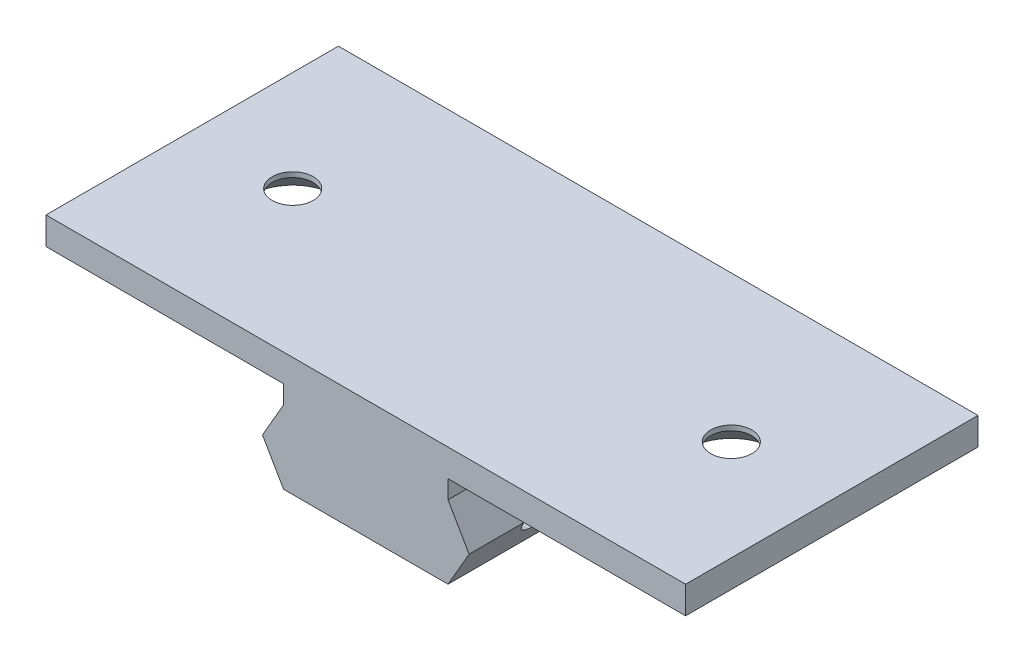
ISO-10303-21;
HEADER;
FILE_DESCRIPTION(('STEP AP214'),'2;1');
FILE_NAME('part.step','',(''),(''),'','','');
FILE_SCHEMA(('AUTOMOTIVE_DESIGN { 1 0 10303 214 1 1 1 1 }'));
ENDSEC;
DATA;
#1=APPLICATION_CONTEXT('core data for automotive mechanical design processes');
#2=APPLICATION_PROTOCOL_DEFINITION('international standard','automotive_design',2000,#1);
#3=PRODUCT_CONTEXT('',#1,'mechanical');
#4=PRODUCT('Part','Part','',(#3));
#5=PRODUCT_RELATED_PRODUCT_CATEGORY('part','',(#4));
#6=PRODUCT_DEFINITION_FORMATION('','',#4);
#7=PRODUCT_DEFINITION_CONTEXT('part definition',#1,'design');
#8=PRODUCT_DEFINITION('design','',#6,#7);
#9=PRODUCT_DEFINITION_SHAPE('','',#8);
#10=(LENGTH_UNIT() NAMED_UNIT(*) SI_UNIT(.MILLI.,.METRE.));
#11=(NAMED_UNIT(*) PLANE_ANGLE_UNIT() SI_UNIT($,.RADIAN.));
#12=(NAMED_UNIT(*) SI_UNIT($,.STERADIAN.) SOLID_ANGLE_UNIT());
#13=UNCERTAINTY_MEASURE_WITH_UNIT(LENGTH_MEASURE(1.E-05),#10,'distance_accuracy_value','');
#14=(GEOMETRIC_REPRESENTATION_CONTEXT(3) GLOBAL_UNCERTAINTY_ASSIGNED_CONTEXT((#13)) GLOBAL_UNIT_ASSIGNED_CONTEXT((#10,
#11,#12)) REPRESENTATION_CONTEXT('',''));
#15=CARTESIAN_POINT('',(0.,0.,0.));
#16=DIRECTION('',(0.,0.,1.));
#17=DIRECTION('',(1.,0.,0.));
#18=AXIS2_PLACEMENT_3D('',#15,#16,#17);
#19=CARTESIAN_POINT('',(11.3094010767585,4.00000000000005,32.));
#20=DIRECTION('',(-0.86602540378444,0.499999999999998,0.));
#21=DIRECTION('',(-0.499999999999998,-0.86602540378444,0.));
#22=AXIS2_PLACEMENT_3D('',#19,#20,#21);
#23=PLANE('',#22);
#24=DIRECTION('',(0.,0.,-1.));
#25=VECTOR('',#24,1.);
#26=CARTESIAN_POINT('',(11.3094010767585,4.00000000000005,32.));
#27=LINE('',#26,#25);
#28=CARTESIAN_POINT('',(11.3094010767585,4.00000000000005,14.));
#29=VERTEX_POINT('',#28);
#30=CARTESIAN_POINT('',(11.3094010767585,4.00000000000005,10.));
#31=VERTEX_POINT('',#30);
#32=EDGE_CURVE('E383',#29,#31,#27,.T.);
#33=ORIENTED_EDGE('',*,*,#32,.F.);
#34=CARTESIAN_POINT('',(11.3094010767585,4.00000000000005,16.));
#35=DIRECTION('',(-0.86602540378444,0.499999999999998,0.));
#36=DIRECTION('',(0.499999999999998,0.86602540378444,0.));
#37=AXIS2_PLACEMENT_3D('',#34,#35,#36);
#38=ELLIPSE('',#37,2.3094010767585,2.);
#39=CARTESIAN_POINT('',(11.3094010767585,4.00000000000005,18.));
#40=VERTEX_POINT('',#39);
#41=EDGE_CURVE('E68',#29,#40,#38,.T.);
#42=ORIENTED_EDGE('',*,*,#41,.T.);
#43=CARTESIAN_POINT('',(11.3094010767585,4.00000000000005,22.));
#44=VERTEX_POINT('',#43);
#45=EDGE_CURVE('E349',#44,#40,#27,.T.);
#46=ORIENTED_EDGE('',*,*,#45,.F.);
#47=CARTESIAN_POINT('',(11.3094010767585,4.00000000000005,24.));
#48=DIRECTION('',(-0.86602540378444,0.499999999999998,0.));
#49=DIRECTION('',(0.499999999999998,0.86602540378444,0.));
#50=AXIS2_PLACEMENT_3D('',#47,#48,#49);
#51=ELLIPSE('',#50,2.3094010767585,2.);
#52=CARTESIAN_POINT('',(11.3094010767585,4.00000000000005,26.));
#53=VERTEX_POINT('',#52);
#54=EDGE_CURVE('E286',#44,#53,#51,.T.);
#55=ORIENTED_EDGE('',*,*,#54,.T.);
#56=CARTESIAN_POINT('',(11.3094010767585,4.00000000000005,32.));
#57=VERTEX_POINT('',#56);
#58=EDGE_CURVE('E344',#57,#53,#27,.T.);
#59=ORIENTED_EDGE('',*,*,#58,.F.);
#60=DIRECTION('',(0.499999999999998,0.86602540378444,0.));
#61=VECTOR('',#60,1.);
#62=CARTESIAN_POINT('',(11.3094010767585,4.00000000000005,32.));
#63=LINE('',#62,#61);
#64=CARTESIAN_POINT('',(9.,0.,32.));
#65=VERTEX_POINT('',#64);
#66=EDGE_CURVE('E291',#65,#57,#63,.T.);
#67=ORIENTED_EDGE('',*,*,#66,.F.);
#68=DIRECTION('',(0.,0.,-1.));
#69=VECTOR('',#68,1.);
#70=CARTESIAN_POINT('',(9.,0.,32.));
#71=LINE('',#70,#69);
#72=CARTESIAN_POINT('',(9.,0.,0.));
#73=VERTEX_POINT('',#72);
#74=EDGE_CURVE('E307',#65,#73,#71,.T.);
#75=ORIENTED_EDGE('',*,*,#74,.T.);
#76=DIRECTION('',(0.499999999999998,0.86602540378444,0.));
#77=VECTOR('',#76,1.);
#78=CARTESIAN_POINT('',(11.3094010767585,4.00000000000005,0.));
#79=LINE('',#78,#77);
#80=CARTESIAN_POINT('',(11.3094010767585,4.00000000000005,0.));
#81=VERTEX_POINT('',#80);
#82=EDGE_CURVE('E290',#73,#81,#79,.T.);
#83=ORIENTED_EDGE('',*,*,#82,.T.);
#84=CARTESIAN_POINT('',(11.3094010767585,4.00000000000005,6.));
#85=VERTEX_POINT('',#84);
#86=EDGE_CURVE('E343',#85,#81,#27,.T.);
#87=ORIENTED_EDGE('',*,*,#86,.F.);
#88=CARTESIAN_POINT('',(11.3094010767585,4.00000000000005,8.));
#89=DIRECTION('',(-0.86602540378444,0.499999999999998,0.));
#90=DIRECTION('',(0.499999999999998,0.86602540378444,0.));
#91=AXIS2_PLACEMENT_3D('',#88,#89,#90);
#92=ELLIPSE('',#91,2.3094010767585,2.);
#93=EDGE_CURVE('E61',#85,#31,#92,.T.);
#94=ORIENTED_EDGE('',*,*,#93,.T.);
#95=EDGE_LOOP('',(#33,#42,#46,#55,#59,#67,#75,#83,#87,#94));
#96=FACE_BOUND('',#95,.T.);
#97=ADVANCED_FACE('F47',(#96),#23,.F.);
#98=CARTESIAN_POINT('',(9.,8.,32.));
#99=DIRECTION('',(-0.866025403784434,-0.500000000000008,0.));
#100=DIRECTION('',(0.500000000000008,-0.866025403784434,0.));
#101=AXIS2_PLACEMENT_3D('',#98,#99,#100);
#102=PLANE('',#101);
#103=ORIENTED_EDGE('',*,*,#45,.T.);
#104=CARTESIAN_POINT('',(11.3094010767585,4.00000000000005,16.));
#105=DIRECTION('',(-0.866025403784434,-0.500000000000008,0.));
#106=DIRECTION('',(0.500000000000008,-0.866025403784434,0.));
#107=AXIS2_PLACEMENT_3D('',#104,#105,#106);
#108=ELLIPSE('',#107,2.30940107675852,2.);
#109=EDGE_CURVE('E273',#40,#29,#108,.T.);
#110=ORIENTED_EDGE('',*,*,#109,.T.);
#111=ORIENTED_EDGE('',*,*,#32,.T.);
#112=CARTESIAN_POINT('',(11.3094010767585,4.00000000000005,8.));
#113=DIRECTION('',(-0.866025403784434,-0.500000000000008,0.));
#114=DIRECTION('',(0.500000000000008,-0.866025403784434,0.));
#115=AXIS2_PLACEMENT_3D('',#112,#113,#114);
#116=ELLIPSE('',#115,2.30940107675852,2.);
#117=EDGE_CURVE('E264',#31,#85,#116,.T.);
#118=ORIENTED_EDGE('',*,*,#117,.T.);
#119=ORIENTED_EDGE('',*,*,#86,.T.);
#120=DIRECTION('',(-0.500000000000008,0.866025403784434,0.));
#121=VECTOR('',#120,1.);
#122=CARTESIAN_POINT('',(9.,8.,0.));
#123=LINE('',#122,#121);
#124=CARTESIAN_POINT('',(9.,8.,0.));
#125=VERTEX_POINT('',#124);
#126=EDGE_CURVE('E311',#81,#125,#123,.T.);
#127=ORIENTED_EDGE('',*,*,#126,.T.);
#128=DIRECTION('',(0.,0.,-1.));
#129=VECTOR('',#128,1.);
#130=CARTESIAN_POINT('',(9.,8.,32.));
#131=LINE('',#130,#129);
#132=CARTESIAN_POINT('',(9.,8.,32.));
#133=VERTEX_POINT('',#132);
#134=EDGE_CURVE('E339',#133,#125,#131,.T.);
#135=ORIENTED_EDGE('',*,*,#134,.F.);
#136=DIRECTION('',(-0.500000000000008,0.866025403784434,0.));
#137=VECTOR('',#136,1.);
#138=CARTESIAN_POINT('',(9.,8.,32.));
#139=LINE('',#138,#137);
#140=EDGE_CURVE('E294',#57,#133,#139,.T.);
#141=ORIENTED_EDGE('',*,*,#140,.F.);
#142=ORIENTED_EDGE('',*,*,#58,.T.);
#143=CARTESIAN_POINT('',(11.3094010767585,4.00000000000005,24.));
#144=DIRECTION('',(-0.866025403784434,-0.500000000000008,0.));
#145=DIRECTION('',(0.500000000000008,-0.866025403784434,0.));
#146=AXIS2_PLACEMENT_3D('',#143,#144,#145);
#147=ELLIPSE('',#146,2.30940107675852,2.);
#148=EDGE_CURVE('E282',#53,#44,#147,.T.);
#149=ORIENTED_EDGE('',*,*,#148,.T.);
#150=EDGE_LOOP('',(#103,#110,#111,#118,#119,#127,#135,#141,#142,#149));
#151=FACE_BOUND('',#150,.T.);
#152=ADVANCED_FACE('F384',(#151),#102,.F.);
#153=CARTESIAN_POINT('',(-11.3094010767585,4.00000000000003,32.));
#154=DIRECTION('',(0.866025403784436,-0.500000000000005,0.));
#155=DIRECTION('',(0.500000000000005,0.866025403784436,0.));
#156=AXIS2_PLACEMENT_3D('',#153,#154,#155);
#157=PLANE('',#156);
#158=DIRECTION('',(0.,0.,-1.));
#159=VECTOR('',#158,1.);
#160=CARTESIAN_POINT('',(-11.3094010767585,4.00000000000003,32.));
#161=LINE('',#160,#159);
#162=CARTESIAN_POINT('',(-11.3094010767585,4.00000000000003,14.));
#163=VERTEX_POINT('',#162);
#164=CARTESIAN_POINT('',(-11.3094010767585,4.00000000000003,10.));
#165=VERTEX_POINT('',#164);
#166=EDGE_CURVE('E360',#163,#165,#161,.T.);
#167=ORIENTED_EDGE('',*,*,#166,.F.);
#168=CARTESIAN_POINT('',(-11.3094010767585,4.00000000000005,16.));
#169=DIRECTION('',(0.866025403784436,-0.500000000000005,0.));
#170=DIRECTION('',(0.500000000000005,0.866025403784436,0.));
#171=AXIS2_PLACEMENT_3D('',#168,#169,#170);
#172=ELLIPSE('',#171,2.30940107675851,2.);
#173=CARTESIAN_POINT('',(-11.3094010767585,4.00000000000003,18.));
#174=VERTEX_POINT('',#173);
#175=EDGE_CURVE('E269',#163,#174,#172,.T.);
#176=ORIENTED_EDGE('',*,*,#175,.T.);
#177=CARTESIAN_POINT('',(-11.3094010767585,4.00000000000003,22.));
#178=VERTEX_POINT('',#177);
#179=EDGE_CURVE('E336',#178,#174,#161,.T.);
#180=ORIENTED_EDGE('',*,*,#179,.F.);
#181=CARTESIAN_POINT('',(-11.3094010767585,4.00000000000005,24.));
#182=DIRECTION('',(0.866025403784436,-0.500000000000005,0.));
#183=DIRECTION('',(0.500000000000005,0.866025403784436,0.));
#184=AXIS2_PLACEMENT_3D('',#181,#182,#183);
#185=ELLIPSE('',#184,2.30940107675851,2.);
#186=CARTESIAN_POINT('',(-11.3094010767585,4.00000000000003,26.));
#187=VERTEX_POINT('',#186);
#188=EDGE_CURVE('E278',#178,#187,#185,.T.);
#189=ORIENTED_EDGE('',*,*,#188,.T.);
#190=CARTESIAN_POINT('',(-11.3094010767585,4.00000000000003,32.));
#191=VERTEX_POINT('',#190);
#192=EDGE_CURVE('E331',#191,#187,#161,.T.);
#193=ORIENTED_EDGE('',*,*,#192,.F.);
#194=DIRECTION('',(-0.500000000000005,-0.866025403784436,0.));
#195=VECTOR('',#194,1.);
#196=CARTESIAN_POINT('',(-11.3094010767585,4.00000000000003,32.));
#197=LINE('',#196,#195);
#198=CARTESIAN_POINT('',(-9.,7.99999999999999,32.));
#199=VERTEX_POINT('',#198);
#200=EDGE_CURVE('E298',#199,#191,#197,.T.);
#201=ORIENTED_EDGE('',*,*,#200,.F.);
#202=DIRECTION('',(0.,0.,-1.));
#203=VECTOR('',#202,1.);
#204=CARTESIAN_POINT('',(-9.,7.99999999999999,32.));
#205=LINE('',#204,#203);
#206=CARTESIAN_POINT('',(-9.,7.99999999999999,0.));
#207=VERTEX_POINT('',#206);
#208=EDGE_CURVE('E335',#199,#207,#205,.T.);
#209=ORIENTED_EDGE('',*,*,#208,.T.);
#210=DIRECTION('',(-0.500000000000005,-0.866025403784436,0.));
#211=VECTOR('',#210,1.);
#212=CARTESIAN_POINT('',(-11.3094010767585,4.00000000000003,0.));
#213=LINE('',#212,#211);
#214=CARTESIAN_POINT('',(-11.3094010767585,4.00000000000003,0.));
#215=VERTEX_POINT('',#214);
#216=EDGE_CURVE('E314',#207,#215,#213,.T.);
#217=ORIENTED_EDGE('',*,*,#216,.T.);
#218=CARTESIAN_POINT('',(-11.3094010767585,4.00000000000003,6.));
#219=VERTEX_POINT('',#218);
#220=EDGE_CURVE('E330',#219,#215,#161,.T.);
#221=ORIENTED_EDGE('',*,*,#220,.F.);
#222=CARTESIAN_POINT('',(-11.3094010767585,4.00000000000005,8.));
#223=DIRECTION('',(0.866025403784436,-0.500000000000005,0.));
#224=DIRECTION('',(0.500000000000005,0.866025403784436,0.));
#225=AXIS2_PLACEMENT_3D('',#222,#223,#224);
#226=ELLIPSE('',#225,2.30940107675851,2.);
#227=EDGE_CURVE('E260',#219,#165,#226,.T.);
#228=ORIENTED_EDGE('',*,*,#227,.T.);
#229=EDGE_LOOP('',(#167,#176,#180,#189,#193,#201,#209,#217,#221,#228));
#230=FACE_BOUND('',#229,.T.);
#231=ADVANCED_FACE('F363',(#230),#157,.F.);
#232=CARTESIAN_POINT('',(-9.,0.,32.));
#233=DIRECTION('',(0.866025403784439,0.499999999999999,0.));
#234=DIRECTION('',(-0.499999999999999,0.866025403784439,0.));
#235=AXIS2_PLACEMENT_3D('',#232,#233,#234);
#236=PLANE('',#235);
#237=ORIENTED_EDGE('',*,*,#179,.T.);
#238=CARTESIAN_POINT('',(-11.3094010767585,4.00000000000005,16.));
#239=DIRECTION('',(0.866025403784439,0.499999999999999,0.));
#240=DIRECTION('',(0.499999999999999,-0.866025403784439,0.));
#241=AXIS2_PLACEMENT_3D('',#238,#239,#240);
#242=ELLIPSE('',#241,2.3094010767585,2.);
#243=EDGE_CURVE('E11',#174,#163,#242,.T.);
#244=ORIENTED_EDGE('',*,*,#243,.T.);
#245=ORIENTED_EDGE('',*,*,#166,.T.);
#246=CARTESIAN_POINT('',(-11.3094010767585,4.00000000000005,8.));
#247=DIRECTION('',(0.866025403784439,0.499999999999999,0.));
#248=DIRECTION('',(0.499999999999999,-0.866025403784439,0.));
#249=AXIS2_PLACEMENT_3D('',#246,#247,#248);
#250=ELLIPSE('',#249,2.3094010767585,2.);
#251=EDGE_CURVE('E55',#165,#219,#250,.T.);
#252=ORIENTED_EDGE('',*,*,#251,.T.);
#253=ORIENTED_EDGE('',*,*,#220,.T.);
#254=DIRECTION('',(0.499999999999999,-0.866025403784439,0.));
#255=VECTOR('',#254,1.);
#256=CARTESIAN_POINT('',(-9.,0.,0.));
#257=LINE('',#256,#255);
#258=CARTESIAN_POINT('',(-9.,0.,0.));
#259=VERTEX_POINT('',#258);
#260=EDGE_CURVE('E318',#215,#259,#257,.T.);
#261=ORIENTED_EDGE('',*,*,#260,.T.);
#262=DIRECTION('',(0.,0.,-1.));
#263=VECTOR('',#262,1.);
#264=CARTESIAN_POINT('',(-9.,0.,32.));
#265=LINE('',#264,#263);
#266=CARTESIAN_POINT('',(-9.,0.,32.));
#267=VERTEX_POINT('',#266);
#268=EDGE_CURVE('E326',#267,#259,#265,.T.);
#269=ORIENTED_EDGE('',*,*,#268,.F.);
#270=DIRECTION('',(0.499999999999999,-0.866025403784439,0.));
#271=VECTOR('',#270,1.);
#272=CARTESIAN_POINT('',(-9.,0.,32.));
#273=LINE('',#272,#271);
#274=EDGE_CURVE('E301',#191,#267,#273,.T.);
#275=ORIENTED_EDGE('',*,*,#274,.F.);
#276=ORIENTED_EDGE('',*,*,#192,.T.);
#277=CARTESIAN_POINT('',(-11.3094010767585,4.00000000000005,24.));
#278=DIRECTION('',(0.866025403784439,0.499999999999999,0.));
#279=DIRECTION('',(0.499999999999999,-0.866025403784439,0.));
#280=AXIS2_PLACEMENT_3D('',#277,#278,#279);
#281=ELLIPSE('',#280,2.3094010767585,2.);
#282=EDGE_CURVE('E348',#187,#178,#281,.T.);
#283=ORIENTED_EDGE('',*,*,#282,.T.);
#284=EDGE_LOOP('',(#237,#244,#245,#252,#253,#261,#269,#275,#276,#283));
#285=FACE_BOUND('',#284,.T.);
#286=ADVANCED_FACE('F358',(#285),#236,.F.);
#287=CARTESIAN_POINT('',(9.,0.,32.));
#288=DIRECTION('',(0.,1.,0.));
#289=DIRECTION('',(-1.,0.,0.));
#290=AXIS2_PLACEMENT_3D('',#287,#288,#289);
#291=PLANE('',#290);
#292=DIRECTION('',(1.,0.,0.));
#293=VECTOR('',#292,1.);
#294=CARTESIAN_POINT('',(9.,0.,0.));
#295=LINE('',#294,#293);
#296=EDGE_CURVE('E295',#259,#73,#295,.T.);
#297=ORIENTED_EDGE('',*,*,#296,.T.);
#298=ORIENTED_EDGE('',*,*,#74,.F.);
#299=DIRECTION('',(1.,0.,0.));
#300=VECTOR('',#299,1.);
#301=CARTESIAN_POINT('',(9.,0.,32.));
#302=LINE('',#301,#300);
#303=EDGE_CURVE('E304',#267,#65,#302,.T.);
#304=ORIENTED_EDGE('',*,*,#303,.F.);
#305=ORIENTED_EDGE('',*,*,#268,.T.);
#306=EDGE_LOOP('',(#297,#298,#304,#305));
#307=FACE_BOUND('',#306,.T.);
#308=ADVANCED_FACE('F401',(#307),#291,.F.);
#309=CARTESIAN_POINT('',(0.,0.,32.));
#310=DIRECTION('',(0.,0.,-1.));
#311=DIRECTION('',(-1.,0.,0.));
#312=AXIS2_PLACEMENT_3D('',#309,#310,#311);
#313=PLANE('',#312);
#314=ORIENTED_EDGE('',*,*,#66,.T.);
#315=ORIENTED_EDGE('',*,*,#140,.T.);
#316=DIRECTION('',(0.,-1.,0.));
#317=VECTOR('',#316,1.);
#318=CARTESIAN_POINT('',(9.,8.,32.));
#319=LINE('',#318,#317);
#320=CARTESIAN_POINT('',(9.,10.,32.));
#321=VERTEX_POINT('',#320);
#322=EDGE_CURVE('E179',#321,#133,#319,.T.);
#323=ORIENTED_EDGE('',*,*,#322,.F.);
#324=DIRECTION('',(1.,0.,0.));
#325=VECTOR('',#324,1.);
#326=CARTESIAN_POINT('',(-35.,10.,32.));
#327=LINE('',#326,#325);
#328=CARTESIAN_POINT('',(35.,10.,32.));
#329=VERTEX_POINT('',#328);
#330=EDGE_CURVE('E172',#321,#329,#327,.T.);
#331=ORIENTED_EDGE('',*,*,#330,.T.);
#332=DIRECTION('',(0.,-1.,0.));
#333=VECTOR('',#332,1.);
#334=CARTESIAN_POINT('',(35.,10.,32.));
#335=LINE('',#334,#333);
#336=CARTESIAN_POINT('',(35.,13.,32.));
#337=VERTEX_POINT('',#336);
#338=EDGE_CURVE('E177',#337,#329,#335,.T.);
#339=ORIENTED_EDGE('',*,*,#338,.F.);
#340=DIRECTION('',(1.,0.,0.));
#341=VECTOR('',#340,1.);
#342=CARTESIAN_POINT('',(-35.,13.,32.));
#343=LINE('',#342,#341);
#344=CARTESIAN_POINT('',(-35.,13.,32.));
#345=VERTEX_POINT('',#344);
#346=EDGE_CURVE('E229',#345,#337,#343,.T.);
#347=ORIENTED_EDGE('',*,*,#346,.F.);
#348=DIRECTION('',(0.,-1.,0.));
#349=VECTOR('',#348,1.);
#350=CARTESIAN_POINT('',(-35.,10.,32.));
#351=LINE('',#350,#349);
#352=CARTESIAN_POINT('',(-35.,10.,32.));
#353=VERTEX_POINT('',#352);
#354=EDGE_CURVE('E214',#345,#353,#351,.T.);
#355=ORIENTED_EDGE('',*,*,#354,.T.);
#356=CARTESIAN_POINT('',(-9.,10.,32.));
#357=VERTEX_POINT('',#356);
#358=EDGE_CURVE('E183',#353,#357,#327,.T.);
#359=ORIENTED_EDGE('',*,*,#358,.T.);
#360=DIRECTION('',(0.,-1.,0.));
#361=VECTOR('',#360,1.);
#362=CARTESIAN_POINT('',(-9.,8.,32.));
#363=LINE('',#362,#361);
#364=EDGE_CURVE('E232',#357,#199,#363,.T.);
#365=ORIENTED_EDGE('',*,*,#364,.T.);
#366=ORIENTED_EDGE('',*,*,#200,.T.);
#367=ORIENTED_EDGE('',*,*,#274,.T.);
#368=ORIENTED_EDGE('',*,*,#303,.T.);
#369=EDGE_LOOP('',(#314,#315,#323,#331,#339,#347,#355,#359,#365,#366,#367,#368));
#370=FACE_BOUND('',#369,.T.);
#371=ADVANCED_FACE('F175',(#370),#313,.F.);
#372=CARTESIAN_POINT('',(0.,0.,0.));
#373=DIRECTION('',(0.,0.,-1.));
#374=DIRECTION('',(-1.,0.,0.));
#375=AXIS2_PLACEMENT_3D('',#372,#373,#374);
#376=PLANE('',#375);
#377=ORIENTED_EDGE('',*,*,#82,.F.);
#378=ORIENTED_EDGE('',*,*,#296,.F.);
#379=ORIENTED_EDGE('',*,*,#260,.F.);
#380=ORIENTED_EDGE('',*,*,#216,.F.);
#381=DIRECTION('',(0.,1.,0.));
#382=VECTOR('',#381,1.);
#383=CARTESIAN_POINT('',(-9.,8.,0.));
#384=LINE('',#383,#382);
#385=CARTESIAN_POINT('',(-9.,10.,0.));
#386=VERTEX_POINT('',#385);
#387=EDGE_CURVE('E244',#207,#386,#384,.T.);
#388=ORIENTED_EDGE('',*,*,#387,.T.);
#389=DIRECTION('',(1.,0.,0.));
#390=VECTOR('',#389,1.);
#391=CARTESIAN_POINT('',(-35.,10.,0.));
#392=LINE('',#391,#390);
#393=CARTESIAN_POINT('',(-35.,10.,0.));
#394=VERTEX_POINT('',#393);
#395=EDGE_CURVE('E236',#394,#386,#392,.T.);
#396=ORIENTED_EDGE('',*,*,#395,.F.);
#397=DIRECTION('',(0.,1.,0.));
#398=VECTOR('',#397,1.);
#399=CARTESIAN_POINT('',(-35.,10.,0.));
#400=LINE('',#399,#398);
#401=CARTESIAN_POINT('',(-35.,13.,0.));
#402=VERTEX_POINT('',#401);
#403=EDGE_CURVE('E222',#394,#402,#400,.T.);
#404=ORIENTED_EDGE('',*,*,#403,.T.);
#405=DIRECTION('',(1.,0.,0.));
#406=VECTOR('',#405,1.);
#407=CARTESIAN_POINT('',(-35.,13.,0.));
#408=LINE('',#407,#406);
#409=CARTESIAN_POINT('',(35.,13.,0.));
#410=VERTEX_POINT('',#409);
#411=EDGE_CURVE('E233',#402,#410,#408,.T.);
#412=ORIENTED_EDGE('',*,*,#411,.T.);
#413=DIRECTION('',(0.,1.,0.));
#414=VECTOR('',#413,1.);
#415=CARTESIAN_POINT('',(35.,10.,0.));
#416=LINE('',#415,#414);
#417=CARTESIAN_POINT('',(35.,10.,0.));
#418=VERTEX_POINT('',#417);
#419=EDGE_CURVE('E195',#418,#410,#416,.T.);
#420=ORIENTED_EDGE('',*,*,#419,.F.);
#421=CARTESIAN_POINT('',(9.,10.,0.));
#422=VERTEX_POINT('',#421);
#423=EDGE_CURVE('E190',#422,#418,#392,.T.);
#424=ORIENTED_EDGE('',*,*,#423,.F.);
#425=DIRECTION('',(0.,1.,0.));
#426=VECTOR('',#425,1.);
#427=CARTESIAN_POINT('',(9.,8.,0.));
#428=LINE('',#427,#426);
#429=EDGE_CURVE('E253',#125,#422,#428,.T.);
#430=ORIENTED_EDGE('',*,*,#429,.F.);
#431=ORIENTED_EDGE('',*,*,#126,.F.);
#432=EDGE_LOOP('',(#377,#378,#379,#380,#388,#396,#404,#412,#420,#424,#430,#431));
#433=FACE_BOUND('',#432,.T.);
#434=ADVANCED_FACE('F394',(#433),#376,.T.);
#435=CARTESIAN_POINT('',(-11.3094010767585,4.00000000000005,24.));
#436=DIRECTION('',(1.,0.,0.));
#437=DIRECTION('',(0.,0.,-1.));
#438=AXIS2_PLACEMENT_3D('',#435,#436,#437);
#439=CYLINDRICAL_SURFACE('',#438,2.);
#440=ORIENTED_EDGE('',*,*,#282,.F.);
#441=ORIENTED_EDGE('',*,*,#188,.F.);
#442=EDGE_LOOP('',(#440,#441));
#443=FACE_BOUND('',#442,.T.);
#444=ORIENTED_EDGE('',*,*,#148,.F.);
#445=ORIENTED_EDGE('',*,*,#54,.F.);
#446=EDGE_LOOP('',(#444,#445));
#447=FACE_BOUND('',#446,.T.);
#448=ADVANCED_FACE('F423',(#443,#447),#439,.F.);
#449=CARTESIAN_POINT('',(-11.3094010767585,4.00000000000005,8.));
#450=DIRECTION('',(1.,0.,0.));
#451=DIRECTION('',(0.,0.,-1.));
#452=AXIS2_PLACEMENT_3D('',#449,#450,#451);
#453=CYLINDRICAL_SURFACE('',#452,2.);
#454=ORIENTED_EDGE('',*,*,#251,.F.);
#455=ORIENTED_EDGE('',*,*,#227,.F.);
#456=EDGE_LOOP('',(#454,#455));
#457=FACE_BOUND('',#456,.T.);
#458=ORIENTED_EDGE('',*,*,#117,.F.);
#459=ORIENTED_EDGE('',*,*,#93,.F.);
#460=EDGE_LOOP('',(#458,#459));
#461=FACE_BOUND('',#460,.T.);
#462=ADVANCED_FACE('F375',(#457,#461),#453,.F.);
#463=CARTESIAN_POINT('',(-11.3094010767585,4.00000000000005,16.));
#464=DIRECTION('',(1.,0.,0.));
#465=DIRECTION('',(0.,0.,-1.));
#466=AXIS2_PLACEMENT_3D('',#463,#464,#465);
#467=CYLINDRICAL_SURFACE('',#466,2.);
#468=ORIENTED_EDGE('',*,*,#243,.F.);
#469=ORIENTED_EDGE('',*,*,#175,.F.);
#470=EDGE_LOOP('',(#468,#469));
#471=FACE_BOUND('',#470,.T.);
#472=ORIENTED_EDGE('',*,*,#109,.F.);
#473=ORIENTED_EDGE('',*,*,#41,.F.);
#474=EDGE_LOOP('',(#472,#473));
#475=FACE_BOUND('',#474,.T.);
#476=ADVANCED_FACE('F372',(#471,#475),#467,.F.);
#477=CARTESIAN_POINT('',(9.,0.,0.));
#478=DIRECTION('',(-1.,0.,0.));
#479=DIRECTION('',(0.,0.,1.));
#480=AXIS2_PLACEMENT_3D('',#477,#478,#479);
#481=PLANE('',#480);
#482=ORIENTED_EDGE('',*,*,#322,.T.);
#483=ORIENTED_EDGE('',*,*,#134,.T.);
#484=ORIENTED_EDGE('',*,*,#429,.T.);
#485=DIRECTION('',(0.,0.,1.));
#486=VECTOR('',#485,1.);
#487=CARTESIAN_POINT('',(9.,10.,32.));
#488=LINE('',#487,#486);
#489=EDGE_CURVE('E257',#422,#321,#488,.T.);
#490=ORIENTED_EDGE('',*,*,#489,.T.);
#491=EDGE_LOOP('',(#482,#483,#484,#490));
#492=FACE_BOUND('',#491,.T.);
#493=ADVANCED_FACE('F374',(#492),#481,.F.);
#494=CARTESIAN_POINT('',(-9.,0.,0.));
#495=DIRECTION('',(-1.,0.,0.));
#496=DIRECTION('',(0.,0.,1.));
#497=AXIS2_PLACEMENT_3D('',#494,#495,#496);
#498=PLANE('',#497);
#499=ORIENTED_EDGE('',*,*,#364,.F.);
#500=DIRECTION('',(0.,0.,1.));
#501=VECTOR('',#500,1.);
#502=CARTESIAN_POINT('',(-9.,10.,32.));
#503=LINE('',#502,#501);
#504=EDGE_CURVE('E248',#386,#357,#503,.T.);
#505=ORIENTED_EDGE('',*,*,#504,.F.);
#506=ORIENTED_EDGE('',*,*,#387,.F.);
#507=ORIENTED_EDGE('',*,*,#208,.F.);
#508=EDGE_LOOP('',(#499,#505,#506,#507));
#509=FACE_BOUND('',#508,.T.);
#510=ADVANCED_FACE('F408',(#509),#498,.T.);
#511=CARTESIAN_POINT('',(-35.,10.,32.));
#512=DIRECTION('',(0.,-1.,0.));
#513=DIRECTION('',(0.,0.,-1.));
#514=AXIS2_PLACEMENT_3D('',#511,#512,#513);
#515=PLANE('',#514);
#516=CARTESIAN_POINT('',(24.,10.,16.));
#517=DIRECTION('',(0.,-1.,0.));
#518=DIRECTION('',(0.,0.,-1.));
#519=AXIS2_PLACEMENT_3D('',#516,#517,#518);
#520=CIRCLE('',#519,4.7);
#521=CARTESIAN_POINT('',(24.,10.,11.3));
#522=VERTEX_POINT('',#521);
#523=EDGE_CURVE('E617',#522,#522,#520,.T.);
#524=ORIENTED_EDGE('',*,*,#523,.F.);
#525=EDGE_LOOP('',(#524));
#526=FACE_BOUND('',#525,.T.);
#527=ORIENTED_EDGE('',*,*,#489,.F.);
#528=ORIENTED_EDGE('',*,*,#423,.T.);
#529=DIRECTION('',(0.,0.,-1.));
#530=VECTOR('',#529,1.);
#531=CARTESIAN_POINT('',(35.,10.,32.));
#532=LINE('',#531,#530);
#533=EDGE_CURVE('E187',#329,#418,#532,.T.);
#534=ORIENTED_EDGE('',*,*,#533,.F.);
#535=ORIENTED_EDGE('',*,*,#330,.F.);
#536=EDGE_LOOP('',(#527,#528,#534,#535));
#537=FACE_BOUND('',#536,.T.);
#538=ADVANCED_FACE('F188',(#526,#537),#515,.T.);
#539=CARTESIAN_POINT('',(-35.,13.,32.));
#540=DIRECTION('',(0.,1.,0.));
#541=DIRECTION('',(0.,0.,1.));
#542=AXIS2_PLACEMENT_3D('',#539,#540,#541);
#543=PLANE('',#542);
#544=CARTESIAN_POINT('',(24.,13.,16.));
#545=DIRECTION('',(0.,-1.,0.));
#546=DIRECTION('',(0.,0.,-1.));
#547=AXIS2_PLACEMENT_3D('',#544,#545,#546);
#548=CIRCLE('',#547,2.25);
#549=CARTESIAN_POINT('',(24.,13.,13.75));
#550=VERTEX_POINT('',#549);
#551=EDGE_CURVE('E621',#550,#550,#548,.T.);
#552=ORIENTED_EDGE('',*,*,#551,.T.);
#553=EDGE_LOOP('',(#552));
#554=FACE_BOUND('',#553,.T.);
#555=CARTESIAN_POINT('',(-24.,13.,16.));
#556=DIRECTION('',(0.,-1.,0.));
#557=DIRECTION('',(0.,0.,-1.));
#558=AXIS2_PLACEMENT_3D('',#555,#556,#557);
#559=CIRCLE('',#558,2.25);
#560=CARTESIAN_POINT('',(-24.,13.,13.75));
#561=VERTEX_POINT('',#560);
#562=EDGE_CURVE('E202',#561,#561,#559,.T.);
#563=ORIENTED_EDGE('',*,*,#562,.T.);
#564=EDGE_LOOP('',(#563));
#565=FACE_BOUND('',#564,.T.);
#566=ORIENTED_EDGE('',*,*,#346,.T.);
#567=DIRECTION('',(0.,0.,1.));
#568=VECTOR('',#567,1.);
#569=CARTESIAN_POINT('',(35.,13.,32.));
#570=LINE('',#569,#568);
#571=EDGE_CURVE('E200',#410,#337,#570,.T.);
#572=ORIENTED_EDGE('',*,*,#571,.F.);
#573=ORIENTED_EDGE('',*,*,#411,.F.);
#574=DIRECTION('',(0.,0.,1.));
#575=VECTOR('',#574,1.);
#576=CARTESIAN_POINT('',(-35.,13.,32.));
#577=LINE('',#576,#575);
#578=EDGE_CURVE('E184',#402,#345,#577,.T.);
#579=ORIENTED_EDGE('',*,*,#578,.T.);
#580=EDGE_LOOP('',(#566,#572,#573,#579));
#581=FACE_BOUND('',#580,.T.);
#582=ADVANCED_FACE('F419',(#554,#565,#581),#543,.T.);
#583=CARTESIAN_POINT('',(-24.,10.,16.));
#584=DIRECTION('',(0.,-1.,0.));
#585=DIRECTION('',(0.,0.,-1.));
#586=AXIS2_PLACEMENT_3D('',#583,#584,#585);
#587=CIRCLE('',#586,4.7);
#588=CARTESIAN_POINT('',(-24.,10.,11.3));
#589=VERTEX_POINT('',#588);
#590=EDGE_CURVE('E627',#589,#589,#587,.T.);
#591=ORIENTED_EDGE('',*,*,#590,.F.);
#592=EDGE_LOOP('',(#591));
#593=FACE_BOUND('',#592,.T.);
#594=ORIENTED_EDGE('',*,*,#395,.T.);
#595=ORIENTED_EDGE('',*,*,#504,.T.);
#596=ORIENTED_EDGE('',*,*,#358,.F.);
#597=DIRECTION('',(0.,0.,-1.));
#598=VECTOR('',#597,1.);
#599=CARTESIAN_POINT('',(-35.,10.,32.));
#600=LINE('',#599,#598);
#601=EDGE_CURVE('E218',#353,#394,#600,.T.);
#602=ORIENTED_EDGE('',*,*,#601,.T.);
#603=EDGE_LOOP('',(#594,#595,#596,#602));
#604=FACE_BOUND('',#603,.T.);
#605=ADVANCED_FACE('F417',(#593,#604),#515,.T.);
#606=CARTESIAN_POINT('',(-35.,0.,0.));
#607=DIRECTION('',(-1.,0.,0.));
#608=DIRECTION('',(0.,0.,1.));
#609=AXIS2_PLACEMENT_3D('',#606,#607,#608);
#610=PLANE('',#609);
#611=ORIENTED_EDGE('',*,*,#354,.F.);
#612=ORIENTED_EDGE('',*,*,#578,.F.);
#613=ORIENTED_EDGE('',*,*,#403,.F.);
#614=ORIENTED_EDGE('',*,*,#601,.F.);
#615=EDGE_LOOP('',(#611,#612,#613,#614));
#616=FACE_BOUND('',#615,.T.);
#617=ADVANCED_FACE('F416',(#616),#610,.T.);
#618=CARTESIAN_POINT('',(35.,0.,0.));
#619=DIRECTION('',(-1.,0.,0.));
#620=DIRECTION('',(0.,0.,1.));
#621=AXIS2_PLACEMENT_3D('',#618,#619,#620);
#622=PLANE('',#621);
#623=ORIENTED_EDGE('',*,*,#338,.T.);
#624=ORIENTED_EDGE('',*,*,#533,.T.);
#625=ORIENTED_EDGE('',*,*,#419,.T.);
#626=ORIENTED_EDGE('',*,*,#571,.T.);
#627=EDGE_LOOP('',(#623,#624,#625,#626));
#628=FACE_BOUND('',#627,.T.);
#629=ADVANCED_FACE('F198',(#628),#622,.F.);
#630=CARTESIAN_POINT('',(-24.,10.,16.));
#631=DIRECTION('',(0.,-1.,0.));
#632=DIRECTION('',(0.,0.,-1.));
#633=AXIS2_PLACEMENT_3D('',#630,#631,#632);
#634=CYLINDRICAL_SURFACE('',#633,2.25);
#635=ORIENTED_EDGE('',*,*,#562,.F.);
#636=EDGE_LOOP('',(#635));
#637=FACE_BOUND('',#636,.T.);
#638=CARTESIAN_POINT('',(-24.,12.45,16.));
#639=DIRECTION('',(0.,-1.,0.));
#640=DIRECTION('',(0.,0.,-1.));
#641=AXIS2_PLACEMENT_3D('',#638,#639,#640);
#642=CIRCLE('',#641,2.25);
#643=CARTESIAN_POINT('',(-24.,12.45,13.75));
#644=VERTEX_POINT('',#643);
#645=EDGE_CURVE('E206',#644,#644,#642,.T.);
#646=ORIENTED_EDGE('',*,*,#645,.T.);
#647=EDGE_LOOP('',(#646));
#648=FACE_BOUND('',#647,.T.);
#649=ADVANCED_FACE('F486',(#637,#648),#634,.F.);
#650=CARTESIAN_POINT('',(-24.,10.,16.));
#651=DIRECTION('',(0.,-1.,0.));
#652=DIRECTION('',(0.,0.,-1.));
#653=AXIS2_PLACEMENT_3D('',#650,#651,#652);
#654=CONICAL_SURFACE('',#653,4.7,0.785398163397449);
#655=ORIENTED_EDGE('',*,*,#645,.F.);
#656=EDGE_LOOP('',(#655));
#657=FACE_BOUND('',#656,.T.);
#658=ORIENTED_EDGE('',*,*,#590,.T.);
#659=EDGE_LOOP('',(#658));
#660=FACE_BOUND('',#659,.T.);
#661=ADVANCED_FACE('F515',(#657,#660),#654,.F.);
#662=CARTESIAN_POINT('',(24.,10.,16.));
#663=DIRECTION('',(0.,-1.,0.));
#664=DIRECTION('',(0.,0.,-1.));
#665=AXIS2_PLACEMENT_3D('',#662,#663,#664);
#666=CYLINDRICAL_SURFACE('',#665,2.25);
#667=ORIENTED_EDGE('',*,*,#551,.F.);
#668=EDGE_LOOP('',(#667));
#669=FACE_BOUND('',#668,.T.);
#670=CARTESIAN_POINT('',(24.,12.45,16.));
#671=DIRECTION('',(0.,-1.,0.));
#672=DIRECTION('',(0.,0.,-1.));
#673=AXIS2_PLACEMENT_3D('',#670,#671,#672);
#674=CIRCLE('',#673,2.25);
#675=CARTESIAN_POINT('',(24.,12.45,13.75));
#676=VERTEX_POINT('',#675);
#677=EDGE_CURVE('E614',#676,#676,#674,.T.);
#678=ORIENTED_EDGE('',*,*,#677,.T.);
#679=EDGE_LOOP('',(#678));
#680=FACE_BOUND('',#679,.T.);
#681=ADVANCED_FACE('F524',(#669,#680),#666,.F.);
#682=CARTESIAN_POINT('',(24.,10.,16.));
#683=DIRECTION('',(0.,-1.,0.));
#684=DIRECTION('',(0.,0.,-1.));
#685=AXIS2_PLACEMENT_3D('',#682,#683,#684);
#686=CONICAL_SURFACE('',#685,4.7,0.785398163397449);
#687=ORIENTED_EDGE('',*,*,#677,.F.);
#688=EDGE_LOOP('',(#687));
#689=FACE_BOUND('',#688,.T.);
#690=ORIENTED_EDGE('',*,*,#523,.T.);
#691=EDGE_LOOP('',(#690));
#692=FACE_BOUND('',#691,.T.);
#693=ADVANCED_FACE('F533',(#689,#692),#686,.F.);
#694=CLOSED_SHELL('',(#97,#152,#231,#286,#308,#371,#434,#448,#462,#476,#493,#510,#538,#582,#605,
#617,#629,#649,#661,#681,#693));
#695=MANIFOLD_SOLID_BREP('B2',#694);
#696=ADVANCED_BREP_SHAPE_REPRESENTATION('',(#18,#695),#14);
#697=SHAPE_DEFINITION_REPRESENTATION(#9,#696);
ENDSEC;
END-ISO-10303-21;
